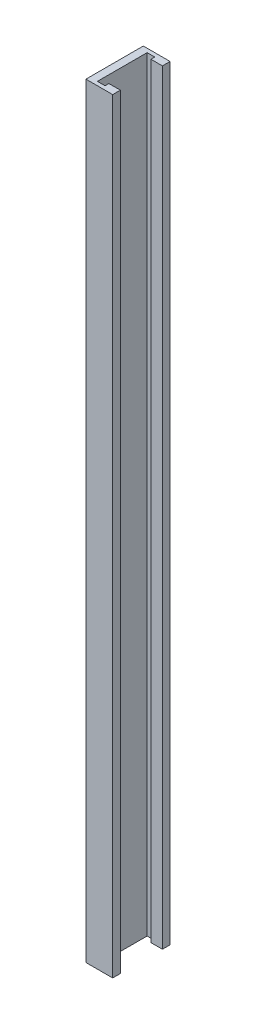
ISO-10303-21;
HEADER;
FILE_DESCRIPTION(('STEP AP214'),'2;1');
FILE_NAME('part.step','',(''),(''),'','','');
FILE_SCHEMA(('AUTOMOTIVE_DESIGN { 1 0 10303 214 1 1 1 1 }'));
ENDSEC;
DATA;
#1=APPLICATION_CONTEXT('core data for automotive mechanical design processes');
#2=APPLICATION_PROTOCOL_DEFINITION('international standard','automotive_design',2000,#1);
#3=PRODUCT_CONTEXT('',#1,'mechanical');
#4=PRODUCT('Part','Part','',(#3));
#5=PRODUCT_RELATED_PRODUCT_CATEGORY('part','',(#4));
#6=PRODUCT_DEFINITION_FORMATION('','',#4);
#7=PRODUCT_DEFINITION_CONTEXT('part definition',#1,'design');
#8=PRODUCT_DEFINITION('design','',#6,#7);
#9=PRODUCT_DEFINITION_SHAPE('','',#8);
#10=(LENGTH_UNIT() NAMED_UNIT(*) SI_UNIT(.MILLI.,.METRE.));
#11=(NAMED_UNIT(*) PLANE_ANGLE_UNIT() SI_UNIT($,.RADIAN.));
#12=(NAMED_UNIT(*) SI_UNIT($,.STERADIAN.) SOLID_ANGLE_UNIT());
#13=UNCERTAINTY_MEASURE_WITH_UNIT(LENGTH_MEASURE(1.E-05),#10,'distance_accuracy_value','');
#14=(GEOMETRIC_REPRESENTATION_CONTEXT(3) GLOBAL_UNCERTAINTY_ASSIGNED_CONTEXT((#13)) GLOBAL_UNIT_ASSIGNED_CONTEXT((#10,
#11,#12)) REPRESENTATION_CONTEXT('',''));
#15=CARTESIAN_POINT('',(0.,0.,0.));
#16=DIRECTION('',(0.,0.,1.));
#17=DIRECTION('',(1.,0.,0.));
#18=AXIS2_PLACEMENT_3D('',#15,#16,#17);
#19=CARTESIAN_POINT('',(7.,0.,0.));
#20=DIRECTION('',(1.,0.,0.));
#21=DIRECTION('',(0.,0.,-1.));
#22=AXIS2_PLACEMENT_3D('',#19,#20,#21);
#23=PLANE('',#22);
#24=DIRECTION('',(0.,1.,0.));
#25=VECTOR('',#24,1.);
#26=CARTESIAN_POINT('',(6.99999999999999,-171.973684210526,11.7368421052632));
#27=LINE('',#26,#25);
#28=CARTESIAN_POINT('',(6.99999999999999,-171.973684210526,11.7368421052632));
#29=VERTEX_POINT('',#28);
#30=CARTESIAN_POINT('',(6.99999999999999,28.0263157894737,11.7368421052632));
#31=VERTEX_POINT('',#30);
#32=EDGE_CURVE('E183',#29,#31,#27,.T.);
#33=ORIENTED_EDGE('',*,*,#32,.T.);
#34=DIRECTION('',(0.,0.,1.));
#35=VECTOR('',#34,1.);
#36=CARTESIAN_POINT('',(7.,28.0263157894737,13.7368421052632));
#37=LINE('',#36,#35);
#38=CARTESIAN_POINT('',(7.,28.0263157894737,13.7368421052632));
#39=VERTEX_POINT('',#38);
#40=EDGE_CURVE('E56',#31,#39,#37,.T.);
#41=ORIENTED_EDGE('',*,*,#40,.T.);
#42=DIRECTION('',(0.,-1.,0.));
#43=VECTOR('',#42,1.);
#44=CARTESIAN_POINT('',(7.,28.0263157894737,13.7368421052632));
#45=LINE('',#44,#43);
#46=CARTESIAN_POINT('',(7.,-171.973684210526,13.7368421052631));
#47=VERTEX_POINT('',#46);
#48=EDGE_CURVE('E196',#39,#47,#45,.T.);
#49=ORIENTED_EDGE('',*,*,#48,.T.);
#50=DIRECTION('',(0.,0.,-1.));
#51=VECTOR('',#50,1.);
#52=CARTESIAN_POINT('',(7.,-171.973684210526,13.7368421052631));
#53=LINE('',#52,#51);
#54=EDGE_CURVE('E85',#47,#29,#53,.T.);
#55=ORIENTED_EDGE('',*,*,#54,.T.);
#56=EDGE_LOOP('',(#33,#41,#49,#55));
#57=FACE_BOUND('',#56,.T.);
#58=ADVANCED_FACE('F32',(#57),#23,.T.);
#59=CARTESIAN_POINT('',(7.,28.0263157894737,13.7368421052632));
#60=DIRECTION('',(0.,0.,-1.));
#61=DIRECTION('',(0.,1.,0.));
#62=AXIS2_PLACEMENT_3D('',#59,#60,#61);
#63=PLANE('',#62);
#64=DIRECTION('',(0.,-1.,0.));
#65=VECTOR('',#64,1.);
#66=CARTESIAN_POINT('',(0.,28.0263157894737,13.7368421052632));
#67=LINE('',#66,#65);
#68=CARTESIAN_POINT('',(0.,28.0263157894737,13.7368421052632));
#69=VERTEX_POINT('',#68);
#70=CARTESIAN_POINT('',(0.,-171.973684210526,13.7368421052631));
#71=VERTEX_POINT('',#70);
#72=EDGE_CURVE('E185',#69,#71,#67,.T.);
#73=ORIENTED_EDGE('',*,*,#72,.T.);
#74=DIRECTION('',(-1.,0.,0.));
#75=VECTOR('',#74,1.);
#76=CARTESIAN_POINT('',(7.,-171.973684210526,13.7368421052631));
#77=LINE('',#76,#75);
#78=EDGE_CURVE('E11',#47,#71,#77,.T.);
#79=ORIENTED_EDGE('',*,*,#78,.F.);
#80=ORIENTED_EDGE('',*,*,#48,.F.);
#81=DIRECTION('',(-1.,0.,0.));
#82=VECTOR('',#81,1.);
#83=CARTESIAN_POINT('',(7.,28.0263157894737,13.7368421052632));
#84=LINE('',#83,#82);
#85=EDGE_CURVE('E204',#39,#69,#84,.T.);
#86=ORIENTED_EDGE('',*,*,#85,.T.);
#87=EDGE_LOOP('',(#73,#79,#80,#86));
#88=FACE_BOUND('',#87,.T.);
#89=ADVANCED_FACE('F34',(#88),#63,.F.);
#90=CARTESIAN_POINT('',(7.,-171.973684210526,13.7368421052631));
#91=DIRECTION('',(0.,1.,0.));
#92=DIRECTION('',(0.,0.,1.));
#93=AXIS2_PLACEMENT_3D('',#90,#91,#92);
#94=PLANE('',#93);
#95=DIRECTION('',(0.,0.,-1.));
#96=VECTOR('',#95,1.);
#97=CARTESIAN_POINT('',(3.99999999999999,-171.973684210526,11.7368421052632));
#98=LINE('',#97,#96);
#99=CARTESIAN_POINT('',(4.,-171.973684210526,12.7368421052632));
#100=VERTEX_POINT('',#99);
#101=CARTESIAN_POINT('',(3.99999999999999,-171.973684210526,11.7368421052632));
#102=VERTEX_POINT('',#101);
#103=EDGE_CURVE('E165',#100,#102,#98,.T.);
#104=ORIENTED_EDGE('',*,*,#103,.T.);
#105=DIRECTION('',(1.,0.,0.));
#106=VECTOR('',#105,1.);
#107=CARTESIAN_POINT('',(6.99999999999999,-171.973684210526,11.7368421052632));
#108=LINE('',#107,#106);
#109=EDGE_CURVE('E167',#102,#29,#108,.T.);
#110=ORIENTED_EDGE('',*,*,#109,.T.);
#111=ORIENTED_EDGE('',*,*,#54,.F.);
#112=ORIENTED_EDGE('',*,*,#78,.T.);
#113=DIRECTION('',(0.,0.,-1.));
#114=VECTOR('',#113,1.);
#115=CARTESIAN_POINT('',(0.,-171.973684210526,13.7368421052631));
#116=LINE('',#115,#114);
#117=CARTESIAN_POINT('',(0.,-171.973684210526,-1.26315789473686));
#118=VERTEX_POINT('',#117);
#119=EDGE_CURVE('E207',#71,#118,#116,.T.);
#120=ORIENTED_EDGE('',*,*,#119,.T.);
#121=DIRECTION('',(-1.,0.,0.));
#122=VECTOR('',#121,1.);
#123=CARTESIAN_POINT('',(7.,-171.973684210526,-1.26315789473686));
#124=LINE('',#123,#122);
#125=CARTESIAN_POINT('',(7.,-171.973684210526,-1.26315789473686));
#126=VERTEX_POINT('',#125);
#127=EDGE_CURVE('E40',#126,#118,#124,.T.);
#128=ORIENTED_EDGE('',*,*,#127,.F.);
#129=CARTESIAN_POINT('',(7.,-171.973684210526,0.736842105263169));
#130=VERTEX_POINT('',#129);
#131=EDGE_CURVE('E152',#130,#126,#53,.T.);
#132=ORIENTED_EDGE('',*,*,#131,.F.);
#133=DIRECTION('',(-1.,0.,0.));
#134=VECTOR('',#133,1.);
#135=CARTESIAN_POINT('',(7.,-171.973684210526,0.736842105263166));
#136=LINE('',#135,#134);
#137=CARTESIAN_POINT('',(4.,-171.973684210526,0.736842105263166));
#138=VERTEX_POINT('',#137);
#139=EDGE_CURVE('E47',#130,#138,#136,.T.);
#140=ORIENTED_EDGE('',*,*,#139,.T.);
#141=DIRECTION('',(0.,0.,-1.));
#142=VECTOR('',#141,1.);
#143=CARTESIAN_POINT('',(4.,-171.973684210526,0.736842105263166));
#144=LINE('',#143,#142);
#145=CARTESIAN_POINT('',(4.,-171.973684210526,-0.263157894736836));
#146=VERTEX_POINT('',#145);
#147=EDGE_CURVE('E142',#138,#146,#144,.T.);
#148=ORIENTED_EDGE('',*,*,#147,.T.);
#149=DIRECTION('',(-1.,0.,0.));
#150=VECTOR('',#149,1.);
#151=CARTESIAN_POINT('',(4.,-171.973684210526,-0.263157894736836));
#152=LINE('',#151,#150);
#153=CARTESIAN_POINT('',(2.,-171.973684210526,-0.263157894736835));
#154=VERTEX_POINT('',#153);
#155=EDGE_CURVE('E146',#146,#154,#152,.T.);
#156=ORIENTED_EDGE('',*,*,#155,.T.);
#157=DIRECTION('',(0.,0.,1.));
#158=VECTOR('',#157,1.);
#159=CARTESIAN_POINT('',(2.,-171.973684210526,-0.263157894736835));
#160=LINE('',#159,#158);
#161=CARTESIAN_POINT('',(2.,-171.973684210526,12.7368421052632));
#162=VERTEX_POINT('',#161);
#163=EDGE_CURVE('E159',#154,#162,#160,.T.);
#164=ORIENTED_EDGE('',*,*,#163,.T.);
#165=DIRECTION('',(1.,0.,0.));
#166=VECTOR('',#165,1.);
#167=CARTESIAN_POINT('',(4.,-171.973684210526,12.7368421052632));
#168=LINE('',#167,#166);
#169=EDGE_CURVE('E162',#162,#100,#168,.T.);
#170=ORIENTED_EDGE('',*,*,#169,.T.);
#171=EDGE_LOOP('',(#104,#110,#111,#112,#120,#128,#132,#140,#148,#156,#164,#170));
#172=FACE_BOUND('',#171,.T.);
#173=ADVANCED_FACE('F150',(#172),#94,.F.);
#174=CARTESIAN_POINT('',(7.,28.0263157894737,-1.26315789473683));
#175=DIRECTION('',(0.,0.,1.));
#176=DIRECTION('',(0.,-1.,0.));
#177=AXIS2_PLACEMENT_3D('',#174,#175,#176);
#178=PLANE('',#177);
#179=DIRECTION('',(0.,1.,0.));
#180=VECTOR('',#179,1.);
#181=CARTESIAN_POINT('',(0.,28.0263157894737,-1.26315789473683));
#182=LINE('',#181,#180);
#183=CARTESIAN_POINT('',(0.,28.0263157894737,-1.26315789473683));
#184=VERTEX_POINT('',#183);
#185=EDGE_CURVE('E209',#118,#184,#182,.T.);
#186=ORIENTED_EDGE('',*,*,#185,.T.);
#187=DIRECTION('',(-1.,0.,0.));
#188=VECTOR('',#187,1.);
#189=CARTESIAN_POINT('',(7.,28.0263157894737,-1.26315789473683));
#190=LINE('',#189,#188);
#191=CARTESIAN_POINT('',(7.,28.0263157894737,-1.26315789473683));
#192=VERTEX_POINT('',#191);
#193=EDGE_CURVE('E213',#192,#184,#190,.T.);
#194=ORIENTED_EDGE('',*,*,#193,.F.);
#195=DIRECTION('',(0.,1.,0.));
#196=VECTOR('',#195,1.);
#197=CARTESIAN_POINT('',(7.,28.0263157894737,-1.26315789473683));
#198=LINE('',#197,#196);
#199=EDGE_CURVE('E199',#126,#192,#198,.T.);
#200=ORIENTED_EDGE('',*,*,#199,.F.);
#201=ORIENTED_EDGE('',*,*,#127,.T.);
#202=EDGE_LOOP('',(#186,#194,#200,#201));
#203=FACE_BOUND('',#202,.T.);
#204=ADVANCED_FACE('F218',(#203),#178,.F.);
#205=CARTESIAN_POINT('',(7.,28.0263157894737,13.7368421052632));
#206=DIRECTION('',(0.,-1.,0.));
#207=DIRECTION('',(0.,0.,-1.));
#208=AXIS2_PLACEMENT_3D('',#205,#206,#207);
#209=PLANE('',#208);
#210=ORIENTED_EDGE('',*,*,#40,.F.);
#211=DIRECTION('',(1.,0.,0.));
#212=VECTOR('',#211,1.);
#213=CARTESIAN_POINT('',(6.99999999999999,28.0263157894737,11.7368421052632));
#214=LINE('',#213,#212);
#215=CARTESIAN_POINT('',(3.99999999999999,28.0263157894737,11.7368421052632));
#216=VERTEX_POINT('',#215);
#217=EDGE_CURVE('E153',#216,#31,#214,.T.);
#218=ORIENTED_EDGE('',*,*,#217,.F.);
#219=DIRECTION('',(0.,0.,-1.));
#220=VECTOR('',#219,1.);
#221=CARTESIAN_POINT('',(3.99999999999999,28.0263157894737,11.7368421052632));
#222=LINE('',#221,#220);
#223=CARTESIAN_POINT('',(4.,28.0263157894737,12.7368421052632));
#224=VERTEX_POINT('',#223);
#225=EDGE_CURVE('E155',#224,#216,#222,.T.);
#226=ORIENTED_EDGE('',*,*,#225,.F.);
#227=DIRECTION('',(1.,0.,0.));
#228=VECTOR('',#227,1.);
#229=CARTESIAN_POINT('',(4.,28.0263157894737,12.7368421052632));
#230=LINE('',#229,#228);
#231=CARTESIAN_POINT('',(2.,28.0263157894737,12.7368421052632));
#232=VERTEX_POINT('',#231);
#233=EDGE_CURVE('E178',#232,#224,#230,.T.);
#234=ORIENTED_EDGE('',*,*,#233,.F.);
#235=DIRECTION('',(0.,0.,1.));
#236=VECTOR('',#235,1.);
#237=CARTESIAN_POINT('',(2.,28.0263157894737,-0.263157894736835));
#238=LINE('',#237,#236);
#239=CARTESIAN_POINT('',(2.,28.0263157894737,-0.263157894736835));
#240=VERTEX_POINT('',#239);
#241=EDGE_CURVE('E175',#240,#232,#238,.T.);
#242=ORIENTED_EDGE('',*,*,#241,.F.);
#243=DIRECTION('',(-1.,0.,0.));
#244=VECTOR('',#243,1.);
#245=CARTESIAN_POINT('',(4.,28.0263157894737,-0.263157894736836));
#246=LINE('',#245,#244);
#247=CARTESIAN_POINT('',(4.,28.0263157894737,-0.263157894736836));
#248=VERTEX_POINT('',#247);
#249=EDGE_CURVE('E172',#248,#240,#246,.T.);
#250=ORIENTED_EDGE('',*,*,#249,.F.);
#251=DIRECTION('',(0.,0.,-1.));
#252=VECTOR('',#251,1.);
#253=CARTESIAN_POINT('',(4.,28.0263157894737,0.736842105263166));
#254=LINE('',#253,#252);
#255=CARTESIAN_POINT('',(4.,28.0263157894737,0.736842105263166));
#256=VERTEX_POINT('',#255);
#257=EDGE_CURVE('E170',#256,#248,#254,.T.);
#258=ORIENTED_EDGE('',*,*,#257,.F.);
#259=DIRECTION('',(-1.,0.,0.));
#260=VECTOR('',#259,1.);
#261=CARTESIAN_POINT('',(7.,28.0263157894737,0.736842105263166));
#262=LINE('',#261,#260);
#263=CARTESIAN_POINT('',(7.,28.0263157894737,0.736842105263166));
#264=VERTEX_POINT('',#263);
#265=EDGE_CURVE('E134',#264,#256,#262,.T.);
#266=ORIENTED_EDGE('',*,*,#265,.F.);
#267=EDGE_CURVE('E201',#192,#264,#37,.T.);
#268=ORIENTED_EDGE('',*,*,#267,.F.);
#269=ORIENTED_EDGE('',*,*,#193,.T.);
#270=DIRECTION('',(0.,0.,1.));
#271=VECTOR('',#270,1.);
#272=CARTESIAN_POINT('',(0.,28.0263157894737,13.7368421052632));
#273=LINE('',#272,#271);
#274=EDGE_CURVE('E78',#184,#69,#273,.T.);
#275=ORIENTED_EDGE('',*,*,#274,.T.);
#276=ORIENTED_EDGE('',*,*,#85,.F.);
#277=EDGE_LOOP('',(#210,#218,#226,#234,#242,#250,#258,#266,#268,#269,#275,#276));
#278=FACE_BOUND('',#277,.T.);
#279=ADVANCED_FACE('F226',(#278),#209,.F.);
#280=DIRECTION('',(0.,1.,0.));
#281=VECTOR('',#280,1.);
#282=CARTESIAN_POINT('',(7.,-171.973684210526,0.736842105263166));
#283=LINE('',#282,#281);
#284=EDGE_CURVE('E139',#130,#264,#283,.T.);
#285=ORIENTED_EDGE('',*,*,#284,.F.);
#286=ORIENTED_EDGE('',*,*,#131,.T.);
#287=ORIENTED_EDGE('',*,*,#199,.T.);
#288=ORIENTED_EDGE('',*,*,#267,.T.);
#289=EDGE_LOOP('',(#285,#286,#287,#288));
#290=FACE_BOUND('',#289,.T.);
#291=ADVANCED_FACE('F235',(#290),#23,.T.);
#292=CARTESIAN_POINT('',(0.,0.,0.));
#293=DIRECTION('',(1.,0.,0.));
#294=DIRECTION('',(0.,0.,-1.));
#295=AXIS2_PLACEMENT_3D('',#292,#293,#294);
#296=PLANE('',#295);
#297=ORIENTED_EDGE('',*,*,#72,.F.);
#298=ORIENTED_EDGE('',*,*,#274,.F.);
#299=ORIENTED_EDGE('',*,*,#185,.F.);
#300=ORIENTED_EDGE('',*,*,#119,.F.);
#301=EDGE_LOOP('',(#297,#298,#299,#300));
#302=FACE_BOUND('',#301,.T.);
#303=ADVANCED_FACE('F222',(#302),#296,.F.);
#304=CARTESIAN_POINT('',(6.99999999999999,-171.973684210526,11.7368421052632));
#305=DIRECTION('',(0.,0.,1.));
#306=DIRECTION('',(1.,0.,0.));
#307=AXIS2_PLACEMENT_3D('',#304,#305,#306);
#308=PLANE('',#307);
#309=ORIENTED_EDGE('',*,*,#217,.T.);
#310=ORIENTED_EDGE('',*,*,#32,.F.);
#311=ORIENTED_EDGE('',*,*,#109,.F.);
#312=DIRECTION('',(0.,1.,0.));
#313=VECTOR('',#312,1.);
#314=CARTESIAN_POINT('',(3.99999999999999,-171.973684210526,11.7368421052632));
#315=LINE('',#314,#313);
#316=EDGE_CURVE('E186',#102,#216,#315,.T.);
#317=ORIENTED_EDGE('',*,*,#316,.T.);
#318=EDGE_LOOP('',(#309,#310,#311,#317));
#319=FACE_BOUND('',#318,.T.);
#320=ADVANCED_FACE('F231',(#319),#308,.F.);
#321=CARTESIAN_POINT('',(3.99999999999999,-171.973684210526,11.7368421052632));
#322=DIRECTION('',(1.,0.,0.));
#323=DIRECTION('',(0.,0.,-1.));
#324=AXIS2_PLACEMENT_3D('',#321,#322,#323);
#325=PLANE('',#324);
#326=ORIENTED_EDGE('',*,*,#225,.T.);
#327=ORIENTED_EDGE('',*,*,#316,.F.);
#328=ORIENTED_EDGE('',*,*,#103,.F.);
#329=DIRECTION('',(0.,1.,0.));
#330=VECTOR('',#329,1.);
#331=CARTESIAN_POINT('',(4.,-171.973684210526,12.7368421052632));
#332=LINE('',#331,#330);
#333=EDGE_CURVE('E188',#100,#224,#332,.T.);
#334=ORIENTED_EDGE('',*,*,#333,.T.);
#335=EDGE_LOOP('',(#326,#327,#328,#334));
#336=FACE_BOUND('',#335,.T.);
#337=ADVANCED_FACE('F261',(#336),#325,.F.);
#338=CARTESIAN_POINT('',(4.,-171.973684210526,12.7368421052632));
#339=DIRECTION('',(0.,0.,1.));
#340=DIRECTION('',(1.,0.,0.));
#341=AXIS2_PLACEMENT_3D('',#338,#339,#340);
#342=PLANE('',#341);
#343=ORIENTED_EDGE('',*,*,#233,.T.);
#344=ORIENTED_EDGE('',*,*,#333,.F.);
#345=ORIENTED_EDGE('',*,*,#169,.F.);
#346=DIRECTION('',(0.,1.,0.));
#347=VECTOR('',#346,1.);
#348=CARTESIAN_POINT('',(2.,-171.973684210526,12.7368421052632));
#349=LINE('',#348,#347);
#350=EDGE_CURVE('E190',#162,#232,#349,.T.);
#351=ORIENTED_EDGE('',*,*,#350,.T.);
#352=EDGE_LOOP('',(#343,#344,#345,#351));
#353=FACE_BOUND('',#352,.T.);
#354=ADVANCED_FACE('F258',(#353),#342,.F.);
#355=CARTESIAN_POINT('',(2.,-171.973684210526,-0.263157894736835));
#356=DIRECTION('',(-1.,0.,0.));
#357=DIRECTION('',(0.,0.,1.));
#358=AXIS2_PLACEMENT_3D('',#355,#356,#357);
#359=PLANE('',#358);
#360=ORIENTED_EDGE('',*,*,#241,.T.);
#361=ORIENTED_EDGE('',*,*,#350,.F.);
#362=ORIENTED_EDGE('',*,*,#163,.F.);
#363=DIRECTION('',(0.,1.,0.));
#364=VECTOR('',#363,1.);
#365=CARTESIAN_POINT('',(2.,-171.973684210526,-0.263157894736835));
#366=LINE('',#365,#364);
#367=EDGE_CURVE('E192',#154,#240,#366,.T.);
#368=ORIENTED_EDGE('',*,*,#367,.T.);
#369=EDGE_LOOP('',(#360,#361,#362,#368));
#370=FACE_BOUND('',#369,.T.);
#371=ADVANCED_FACE('F256',(#370),#359,.F.);
#372=CARTESIAN_POINT('',(4.,-171.973684210526,-0.263157894736836));
#373=DIRECTION('',(0.,0.,-1.));
#374=DIRECTION('',(-1.,0.,0.));
#375=AXIS2_PLACEMENT_3D('',#372,#373,#374);
#376=PLANE('',#375);
#377=ORIENTED_EDGE('',*,*,#249,.T.);
#378=ORIENTED_EDGE('',*,*,#367,.F.);
#379=ORIENTED_EDGE('',*,*,#155,.F.);
#380=DIRECTION('',(0.,1.,0.));
#381=VECTOR('',#380,1.);
#382=CARTESIAN_POINT('',(4.,-171.973684210526,-0.263157894736836));
#383=LINE('',#382,#381);
#384=EDGE_CURVE('E138',#146,#248,#383,.T.);
#385=ORIENTED_EDGE('',*,*,#384,.T.);
#386=EDGE_LOOP('',(#377,#378,#379,#385));
#387=FACE_BOUND('',#386,.T.);
#388=ADVANCED_FACE('F252',(#387),#376,.F.);
#389=CARTESIAN_POINT('',(4.,-171.973684210526,0.736842105263166));
#390=DIRECTION('',(1.,0.,0.));
#391=DIRECTION('',(0.,0.,-1.));
#392=AXIS2_PLACEMENT_3D('',#389,#390,#391);
#393=PLANE('',#392);
#394=ORIENTED_EDGE('',*,*,#257,.T.);
#395=ORIENTED_EDGE('',*,*,#384,.F.);
#396=ORIENTED_EDGE('',*,*,#147,.F.);
#397=DIRECTION('',(0.,1.,0.));
#398=VECTOR('',#397,1.);
#399=CARTESIAN_POINT('',(4.,-171.973684210526,0.736842105263166));
#400=LINE('',#399,#398);
#401=EDGE_CURVE('E130',#138,#256,#400,.T.);
#402=ORIENTED_EDGE('',*,*,#401,.T.);
#403=EDGE_LOOP('',(#394,#395,#396,#402));
#404=FACE_BOUND('',#403,.T.);
#405=ADVANCED_FACE('F143',(#404),#393,.F.);
#406=CARTESIAN_POINT('',(7.,-171.973684210526,0.736842105263166));
#407=DIRECTION('',(0.,0.,-1.));
#408=DIRECTION('',(-1.,0.,0.));
#409=AXIS2_PLACEMENT_3D('',#406,#407,#408);
#410=PLANE('',#409);
#411=ORIENTED_EDGE('',*,*,#265,.T.);
#412=ORIENTED_EDGE('',*,*,#401,.F.);
#413=ORIENTED_EDGE('',*,*,#139,.F.);
#414=ORIENTED_EDGE('',*,*,#284,.T.);
#415=EDGE_LOOP('',(#411,#412,#413,#414));
#416=FACE_BOUND('',#415,.T.);
#417=ADVANCED_FACE('F132',(#416),#410,.F.);
#418=CLOSED_SHELL('',(#58,#89,#173,#204,#279,#291,#303,#320,#337,#354,#371,#388,#405,#417));
#419=MANIFOLD_SOLID_BREP('B2',#418);
#420=ADVANCED_BREP_SHAPE_REPRESENTATION('',(#18,#419),#14);
#421=SHAPE_DEFINITION_REPRESENTATION(#9,#420);
ENDSEC;
END-ISO-10303-21;
